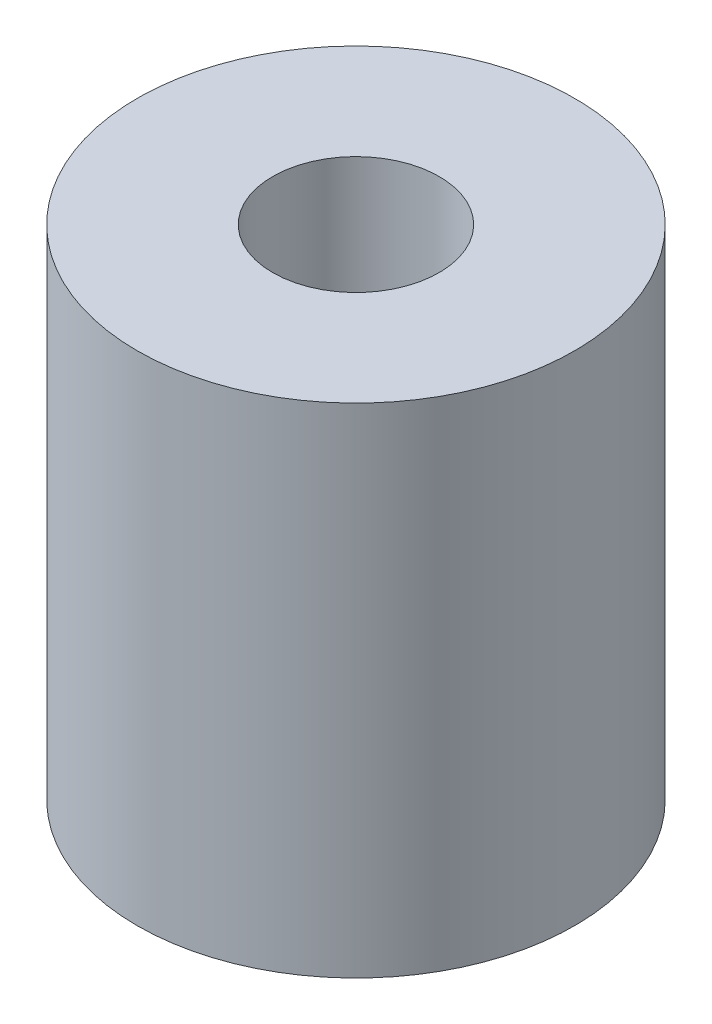
ISO-10303-21;
HEADER;
FILE_DESCRIPTION(('STEP AP214'),'2;1');
FILE_NAME('part.step','',(''),(''),'','','');
FILE_SCHEMA(('AUTOMOTIVE_DESIGN { 1 0 10303 214 1 1 1 1 }'));
ENDSEC;
DATA;
#1=APPLICATION_CONTEXT('core data for automotive mechanical design processes');
#2=APPLICATION_PROTOCOL_DEFINITION('international standard','automotive_design',2000,#1);
#3=PRODUCT_CONTEXT('',#1,'mechanical');
#4=PRODUCT('Part','Part','',(#3));
#5=PRODUCT_RELATED_PRODUCT_CATEGORY('part','',(#4));
#6=PRODUCT_DEFINITION_FORMATION('','',#4);
#7=PRODUCT_DEFINITION_CONTEXT('part definition',#1,'design');
#8=PRODUCT_DEFINITION('design','',#6,#7);
#9=PRODUCT_DEFINITION_SHAPE('','',#8);
#10=(LENGTH_UNIT() NAMED_UNIT(*) SI_UNIT(.MILLI.,.METRE.));
#11=(NAMED_UNIT(*) PLANE_ANGLE_UNIT() SI_UNIT($,.RADIAN.));
#12=(NAMED_UNIT(*) SI_UNIT($,.STERADIAN.) SOLID_ANGLE_UNIT());
#13=UNCERTAINTY_MEASURE_WITH_UNIT(LENGTH_MEASURE(1.E-05),#10,'distance_accuracy_value','');
#14=(GEOMETRIC_REPRESENTATION_CONTEXT(3) GLOBAL_UNCERTAINTY_ASSIGNED_CONTEXT((#13)) GLOBAL_UNIT_ASSIGNED_CONTEXT((#10,
#11,#12)) REPRESENTATION_CONTEXT('',''));
#15=CARTESIAN_POINT('',(0.,0.,0.));
#16=DIRECTION('',(0.,0.,1.));
#17=DIRECTION('',(1.,0.,0.));
#18=AXIS2_PLACEMENT_3D('',#15,#16,#17);
#19=CARTESIAN_POINT('',(0.,29.6,0.));
#20=DIRECTION('',(0.,1.,0.));
#21=DIRECTION('',(0.,0.,1.));
#22=AXIS2_PLACEMENT_3D('',#19,#20,#21);
#23=PLANE('',#22);
#24=CARTESIAN_POINT('',(0.,29.6,0.));
#25=DIRECTION('',(0.,1.,0.));
#26=DIRECTION('',(0.,0.,1.));
#27=AXIS2_PLACEMENT_3D('',#24,#25,#26);
#28=CIRCLE('',#27,13.);
#29=CARTESIAN_POINT('',(0.,29.6,13.));
#30=VERTEX_POINT('',#29);
#31=EDGE_CURVE('E57',#30,#30,#28,.T.);
#32=ORIENTED_EDGE('',*,*,#31,.T.);
#33=EDGE_LOOP('',(#32));
#34=FACE_BOUND('',#33,.T.);
#35=CARTESIAN_POINT('',(0.,29.6,0.));
#36=DIRECTION('',(0.,1.,0.));
#37=DIRECTION('',(0.,0.,1.));
#38=AXIS2_PLACEMENT_3D('',#35,#36,#37);
#39=CIRCLE('',#38,4.95);
#40=CARTESIAN_POINT('',(0.,29.6,4.95));
#41=VERTEX_POINT('',#40);
#42=EDGE_CURVE('E65',#41,#41,#39,.T.);
#43=ORIENTED_EDGE('',*,*,#42,.F.);
#44=EDGE_LOOP('',(#43));
#45=FACE_BOUND('',#44,.T.);
#46=ADVANCED_FACE('F46',(#34,#45),#23,.T.);
#47=CARTESIAN_POINT('',(0.,0.,0.));
#48=DIRECTION('',(0.,1.,0.));
#49=DIRECTION('',(0.,0.,1.));
#50=AXIS2_PLACEMENT_3D('',#47,#48,#49);
#51=PLANE('',#50);
#52=CARTESIAN_POINT('',(0.,0.,0.));
#53=DIRECTION('',(0.,1.,0.));
#54=DIRECTION('',(0.,0.,1.));
#55=AXIS2_PLACEMENT_3D('',#52,#53,#54);
#56=CIRCLE('',#55,13.);
#57=CARTESIAN_POINT('',(0.,0.,13.));
#58=VERTEX_POINT('',#57);
#59=EDGE_CURVE('E61',#58,#58,#56,.T.);
#60=ORIENTED_EDGE('',*,*,#59,.F.);
#61=EDGE_LOOP('',(#60));
#62=FACE_BOUND('',#61,.T.);
#63=CARTESIAN_POINT('',(0.,0.,0.));
#64=DIRECTION('',(0.,-1.,0.));
#65=DIRECTION('',(0.,0.,-1.));
#66=AXIS2_PLACEMENT_3D('',#63,#64,#65);
#67=CIRCLE('',#66,3.9);
#68=CARTESIAN_POINT('',(0.,0.,-3.9));
#69=VERTEX_POINT('',#68);
#70=EDGE_CURVE('E69',#69,#69,#67,.T.);
#71=ORIENTED_EDGE('',*,*,#70,.F.);
#72=EDGE_LOOP('',(#71));
#73=FACE_BOUND('',#72,.T.);
#74=ADVANCED_FACE('F75',(#62,#73),#51,.F.);
#75=CARTESIAN_POINT('',(0.,29.6,0.));
#76=DIRECTION('',(0.,-1.,0.));
#77=DIRECTION('',(0.,0.,-1.));
#78=AXIS2_PLACEMENT_3D('',#75,#76,#77);
#79=CYLINDRICAL_SURFACE('',#78,13.);
#80=ORIENTED_EDGE('',*,*,#31,.F.);
#81=EDGE_LOOP('',(#80));
#82=FACE_BOUND('',#81,.T.);
#83=ORIENTED_EDGE('',*,*,#59,.T.);
#84=EDGE_LOOP('',(#83));
#85=FACE_BOUND('',#84,.T.);
#86=ADVANCED_FACE('F48',(#82,#85),#79,.T.);
#87=CARTESIAN_POINT('',(0.,29.6,0.));
#88=DIRECTION('',(0.,-1.,0.));
#89=DIRECTION('',(0.,0.,-1.));
#90=AXIS2_PLACEMENT_3D('',#87,#88,#89);
#91=CYLINDRICAL_SURFACE('',#90,4.95);
#92=CARTESIAN_POINT('',(0.,18.650573,0.));
#93=DIRECTION('',(0.,1.,0.));
#94=DIRECTION('',(0.,0.,1.));
#95=AXIS2_PLACEMENT_3D('',#92,#93,#94);
#96=CIRCLE('',#95,4.95);
#97=CARTESIAN_POINT('',(0.,18.650573,4.95));
#98=VERTEX_POINT('',#97);
#99=EDGE_CURVE('E53',#98,#98,#96,.T.);
#100=ORIENTED_EDGE('',*,*,#99,.F.);
#101=EDGE_LOOP('',(#100));
#102=FACE_BOUND('',#101,.T.);
#103=ORIENTED_EDGE('',*,*,#42,.T.);
#104=EDGE_LOOP('',(#103));
#105=FACE_BOUND('',#104,.T.);
#106=ADVANCED_FACE('F82',(#102,#105),#91,.F.);
#107=CARTESIAN_POINT('',(0.,18.650573,0.));
#108=DIRECTION('',(0.,1.,0.));
#109=DIRECTION('',(0.,0.,1.));
#110=AXIS2_PLACEMENT_3D('',#107,#108,#109);
#111=PLANE('',#110);
#112=ORIENTED_EDGE('',*,*,#99,.T.);
#113=EDGE_LOOP('',(#112));
#114=FACE_BOUND('',#113,.T.);
#115=ADVANCED_FACE('F90',(#114),#111,.T.);
#116=CARTESIAN_POINT('',(0.,11.85,0.));
#117=DIRECTION('',(0.,-1.,0.));
#118=DIRECTION('',(0.,0.,-1.));
#119=AXIS2_PLACEMENT_3D('',#116,#117,#118);
#120=CYLINDRICAL_SURFACE('',#119,3.9);
#121=ORIENTED_EDGE('',*,*,#70,.T.);
#122=EDGE_LOOP('',(#121));
#123=FACE_BOUND('',#122,.T.);
#124=CARTESIAN_POINT('',(0.,10.,0.));
#125=DIRECTION('',(0.,1.,0.));
#126=DIRECTION('',(0.,0.,1.));
#127=AXIS2_PLACEMENT_3D('',#124,#125,#126);
#128=CIRCLE('',#127,3.9);
#129=CARTESIAN_POINT('',(0.,10.,3.9));
#130=VERTEX_POINT('',#129);
#131=EDGE_CURVE('E13',#130,#130,#128,.T.);
#132=ORIENTED_EDGE('',*,*,#131,.T.);
#133=EDGE_LOOP('',(#132));
#134=FACE_BOUND('',#133,.T.);
#135=ADVANCED_FACE('F73',(#123,#134),#120,.F.);
#136=CARTESIAN_POINT('',(0.,10.,0.));
#137=DIRECTION('',(0.,1.,0.));
#138=DIRECTION('',(0.,0.,1.));
#139=AXIS2_PLACEMENT_3D('',#136,#137,#138);
#140=PLANE('',#139);
#141=ORIENTED_EDGE('',*,*,#131,.F.);
#142=EDGE_LOOP('',(#141));
#143=FACE_BOUND('',#142,.T.);
#144=ADVANCED_FACE('F94',(#143),#140,.F.);
#145=CLOSED_SHELL('',(#46,#74,#86,#106,#115,#135,#144));
#146=MANIFOLD_SOLID_BREP('B2',#145);
#147=ADVANCED_BREP_SHAPE_REPRESENTATION('',(#18,#146),#14);
#148=SHAPE_DEFINITION_REPRESENTATION(#9,#147);
ENDSEC;
END-ISO-10303-21;
